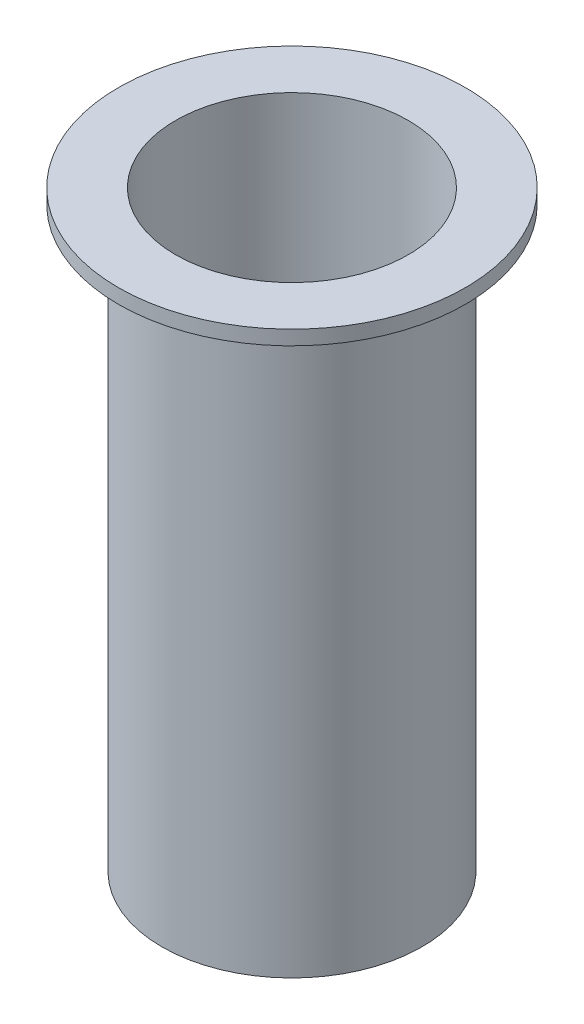
ISO-10303-21;
HEADER;
FILE_DESCRIPTION(('STEP AP214'),'2;1');
FILE_NAME('part.step','',(''),(''),'','','');
FILE_SCHEMA(('AUTOMOTIVE_DESIGN { 1 0 10303 214 1 1 1 1 }'));
ENDSEC;
DATA;
#1=APPLICATION_CONTEXT('core data for automotive mechanical design processes');
#2=APPLICATION_PROTOCOL_DEFINITION('international standard','automotive_design',2000,#1);
#3=PRODUCT_CONTEXT('',#1,'mechanical');
#4=PRODUCT('Part','Part','',(#3));
#5=PRODUCT_RELATED_PRODUCT_CATEGORY('part','',(#4));
#6=PRODUCT_DEFINITION_FORMATION('','',#4);
#7=PRODUCT_DEFINITION_CONTEXT('part definition',#1,'design');
#8=PRODUCT_DEFINITION('design','',#6,#7);
#9=PRODUCT_DEFINITION_SHAPE('','',#8);
#10=(LENGTH_UNIT() NAMED_UNIT(*) SI_UNIT(.MILLI.,.METRE.));
#11=(NAMED_UNIT(*) PLANE_ANGLE_UNIT() SI_UNIT($,.RADIAN.));
#12=(NAMED_UNIT(*) SI_UNIT($,.STERADIAN.) SOLID_ANGLE_UNIT());
#13=UNCERTAINTY_MEASURE_WITH_UNIT(LENGTH_MEASURE(1.E-05),#10,'distance_accuracy_value','');
#14=(GEOMETRIC_REPRESENTATION_CONTEXT(3) GLOBAL_UNCERTAINTY_ASSIGNED_CONTEXT((#13)) GLOBAL_UNIT_ASSIGNED_CONTEXT((#10,
#11,#12)) REPRESENTATION_CONTEXT('',''));
#15=CARTESIAN_POINT('',(0.,0.,0.));
#16=DIRECTION('',(0.,0.,1.));
#17=DIRECTION('',(1.,0.,0.));
#18=AXIS2_PLACEMENT_3D('',#15,#16,#17);
#19=CARTESIAN_POINT('',(0.,-260.35,0.));
#20=DIRECTION('',(0.,1.,0.));
#21=DIRECTION('',(0.,0.,1.));
#22=AXIS2_PLACEMENT_3D('',#19,#20,#21);
#23=CYLINDRICAL_SURFACE('',#22,57.15);
#24=CARTESIAN_POINT('',(0.,-260.35,0.));
#25=DIRECTION('',(0.,1.,0.));
#26=DIRECTION('',(0.,0.,1.));
#27=AXIS2_PLACEMENT_3D('',#24,#25,#26);
#28=CIRCLE('',#27,57.15);
#29=CARTESIAN_POINT('',(0.,-260.35,57.15));
#30=VERTEX_POINT('',#29);
#31=EDGE_CURVE('E10',#30,#30,#28,.T.);
#32=ORIENTED_EDGE('',*,*,#31,.T.);
#33=EDGE_LOOP('',(#32));
#34=FACE_BOUND('',#33,.T.);
#35=CARTESIAN_POINT('',(0.,-6.35000000000002,0.));
#36=DIRECTION('',(0.,1.,0.));
#37=DIRECTION('',(0.,0.,1.));
#38=AXIS2_PLACEMENT_3D('',#35,#36,#37);
#39=CIRCLE('',#38,57.15);
#40=CARTESIAN_POINT('',(0.,-6.35000000000002,57.15));
#41=VERTEX_POINT('',#40);
#42=EDGE_CURVE('E34',#41,#41,#39,.F.);
#43=ORIENTED_EDGE('',*,*,#42,.T.);
#44=EDGE_LOOP('',(#43));
#45=FACE_BOUND('',#44,.T.);
#46=ADVANCED_FACE('F31',(#34,#45),#23,.T.);
#47=CARTESIAN_POINT('',(0.,-260.35,0.));
#48=DIRECTION('',(0.,1.,0.));
#49=DIRECTION('',(0.,0.,1.));
#50=AXIS2_PLACEMENT_3D('',#47,#48,#49);
#51=PLANE('',#50);
#52=CARTESIAN_POINT('',(0.,-260.35,0.));
#53=DIRECTION('',(0.,1.,0.));
#54=DIRECTION('',(0.,0.,1.));
#55=AXIS2_PLACEMENT_3D('',#52,#53,#54);
#56=CIRCLE('',#55,51.1302);
#57=CARTESIAN_POINT('',(0.,-260.35,51.1302));
#58=VERTEX_POINT('',#57);
#59=EDGE_CURVE('E38',#58,#58,#56,.T.);
#60=ORIENTED_EDGE('',*,*,#59,.T.);
#61=EDGE_LOOP('',(#60));
#62=FACE_BOUND('',#61,.T.);
#63=ORIENTED_EDGE('',*,*,#31,.F.);
#64=EDGE_LOOP('',(#63));
#65=FACE_BOUND('',#64,.T.);
#66=ADVANCED_FACE('F69',(#62,#65),#51,.F.);
#67=CARTESIAN_POINT('',(0.,0.,0.));
#68=DIRECTION('',(0.,1.,0.));
#69=DIRECTION('',(0.,0.,1.));
#70=AXIS2_PLACEMENT_3D('',#67,#68,#69);
#71=PLANE('',#70);
#72=CARTESIAN_POINT('',(0.,0.,0.));
#73=DIRECTION('',(0.,1.,0.));
#74=DIRECTION('',(0.,0.,1.));
#75=AXIS2_PLACEMENT_3D('',#72,#73,#74);
#76=CIRCLE('',#75,51.1302);
#77=CARTESIAN_POINT('',(0.,0.,51.1302));
#78=VERTEX_POINT('',#77);
#79=EDGE_CURVE('E42',#78,#78,#76,.T.);
#80=ORIENTED_EDGE('',*,*,#79,.F.);
#81=EDGE_LOOP('',(#80));
#82=FACE_BOUND('',#81,.T.);
#83=CARTESIAN_POINT('',(0.,0.,0.));
#84=DIRECTION('',(0.,1.,0.));
#85=DIRECTION('',(0.,0.,1.));
#86=AXIS2_PLACEMENT_3D('',#83,#84,#85);
#87=CIRCLE('',#86,76.2);
#88=CARTESIAN_POINT('',(0.,0.,76.2));
#89=VERTEX_POINT('',#88);
#90=EDGE_CURVE('E47',#89,#89,#87,.T.);
#91=ORIENTED_EDGE('',*,*,#90,.T.);
#92=EDGE_LOOP('',(#91));
#93=FACE_BOUND('',#92,.T.);
#94=ADVANCED_FACE('F73',(#82,#93),#71,.T.);
#95=CARTESIAN_POINT('',(0.,-260.35,0.));
#96=DIRECTION('',(0.,1.,0.));
#97=DIRECTION('',(0.,0.,1.));
#98=AXIS2_PLACEMENT_3D('',#95,#96,#97);
#99=CYLINDRICAL_SURFACE('',#98,51.1302);
#100=ORIENTED_EDGE('',*,*,#59,.F.);
#101=EDGE_LOOP('',(#100));
#102=FACE_BOUND('',#101,.T.);
#103=ORIENTED_EDGE('',*,*,#79,.T.);
#104=EDGE_LOOP('',(#103));
#105=FACE_BOUND('',#104,.T.);
#106=ADVANCED_FACE('F66',(#102,#105),#99,.F.);
#107=CARTESIAN_POINT('',(0.,-6.35,0.));
#108=DIRECTION('',(0.,1.,0.));
#109=DIRECTION('',(0.,0.,1.));
#110=AXIS2_PLACEMENT_3D('',#107,#108,#109);
#111=CYLINDRICAL_SURFACE('',#110,76.2);
#112=CARTESIAN_POINT('',(0.,-6.35,0.));
#113=DIRECTION('',(0.,1.,0.));
#114=DIRECTION('',(0.,0.,1.));
#115=AXIS2_PLACEMENT_3D('',#112,#113,#114);
#116=CIRCLE('',#115,76.2);
#117=CARTESIAN_POINT('',(0.,-6.35,76.2));
#118=VERTEX_POINT('',#117);
#119=EDGE_CURVE('E50',#118,#118,#116,.T.);
#120=ORIENTED_EDGE('',*,*,#119,.T.);
#121=EDGE_LOOP('',(#120));
#122=FACE_BOUND('',#121,.T.);
#123=ORIENTED_EDGE('',*,*,#90,.F.);
#124=EDGE_LOOP('',(#123));
#125=FACE_BOUND('',#124,.T.);
#126=ADVANCED_FACE('F61',(#122,#125),#111,.T.);
#127=CARTESIAN_POINT('',(0.,-6.35,0.));
#128=DIRECTION('',(0.,1.,0.));
#129=DIRECTION('',(0.,0.,1.));
#130=AXIS2_PLACEMENT_3D('',#127,#128,#129);
#131=PLANE('',#130);
#132=ORIENTED_EDGE('',*,*,#42,.F.);
#133=EDGE_LOOP('',(#132));
#134=FACE_BOUND('',#133,.T.);
#135=ORIENTED_EDGE('',*,*,#119,.F.);
#136=EDGE_LOOP('',(#135));
#137=FACE_BOUND('',#136,.T.);
#138=ADVANCED_FACE('F58',(#134,#137),#131,.F.);
#139=CLOSED_SHELL('',(#46,#66,#94,#106,#126,#138));
#140=MANIFOLD_SOLID_BREP('B2',#139);
#141=ADVANCED_BREP_SHAPE_REPRESENTATION('',(#18,#140),#14);
#142=SHAPE_DEFINITION_REPRESENTATION(#9,#141);
ENDSEC;
END-ISO-10303-21;
